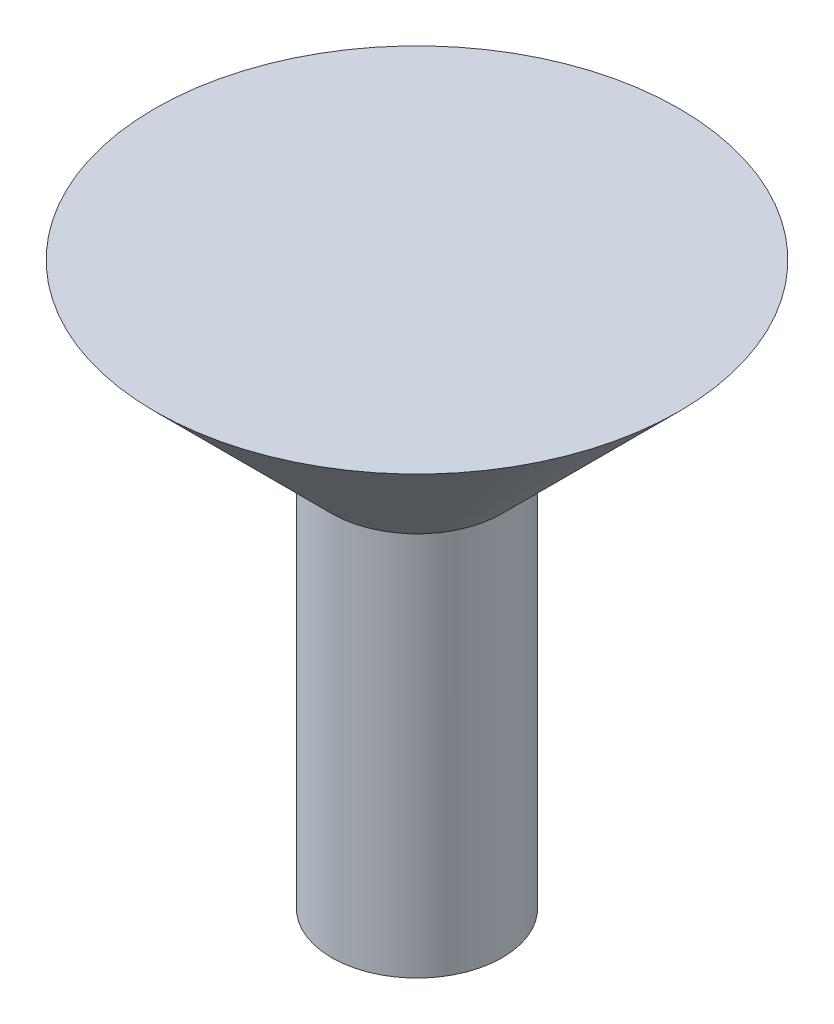
ISO-10303-21;
HEADER;
FILE_DESCRIPTION(('STEP AP214'),'2;1');
FILE_NAME('part.step','',(''),(''),'','','');
FILE_SCHEMA(('AUTOMOTIVE_DESIGN { 1 0 10303 214 1 1 1 1 }'));
ENDSEC;
DATA;
#1=APPLICATION_CONTEXT('core data for automotive mechanical design processes');
#2=APPLICATION_PROTOCOL_DEFINITION('international standard','automotive_design',2000,#1);
#3=PRODUCT_CONTEXT('',#1,'mechanical');
#4=PRODUCT('Part','Part','',(#3));
#5=PRODUCT_RELATED_PRODUCT_CATEGORY('part','',(#4));
#6=PRODUCT_DEFINITION_FORMATION('','',#4);
#7=PRODUCT_DEFINITION_CONTEXT('part definition',#1,'design');
#8=PRODUCT_DEFINITION('design','',#6,#7);
#9=PRODUCT_DEFINITION_SHAPE('','',#8);
#10=(LENGTH_UNIT() NAMED_UNIT(*) SI_UNIT(.MILLI.,.METRE.));
#11=(NAMED_UNIT(*) PLANE_ANGLE_UNIT() SI_UNIT($,.RADIAN.));
#12=(NAMED_UNIT(*) SI_UNIT($,.STERADIAN.) SOLID_ANGLE_UNIT());
#13=UNCERTAINTY_MEASURE_WITH_UNIT(LENGTH_MEASURE(1.E-05),#10,'distance_accuracy_value','');
#14=(GEOMETRIC_REPRESENTATION_CONTEXT(3) GLOBAL_UNCERTAINTY_ASSIGNED_CONTEXT((#13)) GLOBAL_UNIT_ASSIGNED_CONTEXT((#10,
#11,#12)) REPRESENTATION_CONTEXT('',''));
#15=CARTESIAN_POINT('',(0.,0.,0.));
#16=DIRECTION('',(0.,0.,1.));
#17=DIRECTION('',(1.,0.,0.));
#18=AXIS2_PLACEMENT_3D('',#15,#16,#17);
#19=CARTESIAN_POINT('',(-7.01715728752538,2.3,0.));
#20=DIRECTION('',(0.,1.,0.));
#21=DIRECTION('',(0.,0.,1.));
#22=AXIS2_PLACEMENT_3D('',#19,#20,#21);
#23=PLANE('',#22);
#24=CARTESIAN_POINT('',(-0.199999999999999,2.3,0.));
#25=DIRECTION('',(0.,1.,0.));
#26=DIRECTION('',(0.,0.,1.));
#27=AXIS2_PLACEMENT_3D('',#24,#25,#26);
#28=CIRCLE('',#27,6.81715728752538);
#29=CARTESIAN_POINT('',(-0.199999999999999,2.3,6.81715728752538));
#30=VERTEX_POINT('',#29);
#31=EDGE_CURVE('E10',#30,#30,#28,.T.);
#32=ORIENTED_EDGE('',*,*,#31,.T.);
#33=EDGE_LOOP('',(#32));
#34=FACE_BOUND('',#33,.T.);
#35=ADVANCED_FACE('F37',(#34),#23,.T.);
#36=CARTESIAN_POINT('',(-0.199999999999999,2.3,0.));
#37=DIRECTION('',(0.,1.,0.));
#38=DIRECTION('',(0.,0.,1.));
#39=AXIS2_PLACEMENT_3D('',#36,#37,#38);
#40=CONICAL_SURFACE('',#39,6.81715728752538,0.785398163397448);
#41=CARTESIAN_POINT('',(-0.199999999999999,-2.3,0.));
#42=DIRECTION('',(0.,-1.,0.));
#43=DIRECTION('',(0.,0.,-1.));
#44=AXIS2_PLACEMENT_3D('',#41,#42,#43);
#45=CIRCLE('',#44,2.21715728752538);
#46=CARTESIAN_POINT('',(-0.199999999999999,-2.3,2.21715728752538));
#47=VERTEX_POINT('',#46);
#48=EDGE_CURVE('E47',#47,#47,#45,.T.);
#49=CARTESIAN_POINT('',(-0.199999999999999,-2.3,2.21715728752538));
#50=CARTESIAN_POINT('',(-0.199999999999999,-2.25208333333333,2.26507395419205));
#51=CARTESIAN_POINT('',(-0.199999999999999,-2.20416666666667,2.31299062085871));
#52=CARTESIAN_POINT('',(-0.199999999999999,-2.10833333333333,2.40882395419205));
#53=CARTESIAN_POINT('',(-0.199999999999999,-2.06041666666667,2.45674062085871));
#54=CARTESIAN_POINT('',(-0.199999999999999,-1.96458333333333,2.55257395419205));
#55=CARTESIAN_POINT('',(-0.199999999999999,-1.91666666666667,2.60049062085871));
#56=CARTESIAN_POINT('',(-0.199999999999999,-1.82083333333333,2.69632395419205));
#57=CARTESIAN_POINT('',(-0.199999999999999,-1.77291666666667,2.74424062085871));
#58=CARTESIAN_POINT('',(-0.199999999999999,-1.67708333333333,2.84007395419205));
#59=CARTESIAN_POINT('',(-0.199999999999999,-1.62916666666667,2.88799062085871));
#60=CARTESIAN_POINT('',(-0.199999999999999,-1.53333333333333,2.98382395419205));
#61=CARTESIAN_POINT('',(-0.199999999999999,-1.48541666666667,3.03174062085871));
#62=CARTESIAN_POINT('',(-0.199999999999999,-1.38958333333333,3.12757395419205));
#63=CARTESIAN_POINT('',(-0.199999999999999,-1.34166666666667,3.17549062085871));
#64=CARTESIAN_POINT('',(-0.199999999999999,-1.24583333333333,3.27132395419205));
#65=CARTESIAN_POINT('',(-0.199999999999999,-1.19791666666667,3.31924062085871));
#66=CARTESIAN_POINT('',(-0.199999999999999,-1.10208333333333,3.41507395419205));
#67=CARTESIAN_POINT('',(-0.199999999999999,-1.05416666666667,3.46299062085871));
#68=CARTESIAN_POINT('',(-0.199999999999999,-0.958333333333333,3.55882395419205));
#69=CARTESIAN_POINT('',(-0.199999999999999,-0.910416666666667,3.60674062085871));
#70=CARTESIAN_POINT('',(-0.199999999999999,-0.814583333333333,3.70257395419205));
#71=CARTESIAN_POINT('',(-0.199999999999999,-0.766666666666666,3.75049062085871));
#72=CARTESIAN_POINT('',(-0.199999999999999,-0.670833333333333,3.84632395419205));
#73=CARTESIAN_POINT('',(-0.199999999999999,-0.622916666666667,3.89424062085871));
#74=CARTESIAN_POINT('',(-0.199999999999999,-0.527083333333333,3.99007395419205));
#75=CARTESIAN_POINT('',(-0.199999999999999,-0.479166666666667,4.03799062085871));
#76=CARTESIAN_POINT('',(-0.199999999999999,-0.383333333333333,4.13382395419205));
#77=CARTESIAN_POINT('',(-0.199999999999999,-0.335416666666667,4.18174062085872));
#78=CARTESIAN_POINT('',(-0.199999999999999,-0.239583333333333,4.27757395419205));
#79=CARTESIAN_POINT('',(-0.199999999999999,-0.191666666666667,4.32549062085871));
#80=CARTESIAN_POINT('',(-0.199999999999999,-0.0958333333333331,4.42132395419205));
#81=CARTESIAN_POINT('',(-0.199999999999999,-0.0479166666666666,4.46924062085871));
#82=CARTESIAN_POINT('',(-0.199999999999999,0.0479166666666666,4.56507395419205));
#83=CARTESIAN_POINT('',(-0.199999999999999,0.0958333333333331,4.61299062085871));
#84=CARTESIAN_POINT('',(-0.199999999999999,0.191666666666667,4.70882395419205));
#85=CARTESIAN_POINT('',(-0.199999999999999,0.239583333333333,4.75674062085871));
#86=CARTESIAN_POINT('',(-0.199999999999999,0.335416666666667,4.85257395419205));
#87=CARTESIAN_POINT('',(-0.199999999999999,0.383333333333333,4.90049062085871));
#88=CARTESIAN_POINT('',(-0.199999999999999,0.479166666666667,4.99632395419205));
#89=CARTESIAN_POINT('',(-0.199999999999999,0.527083333333333,5.04424062085871));
#90=CARTESIAN_POINT('',(-0.199999999999999,0.622916666666667,5.14007395419205));
#91=CARTESIAN_POINT('',(-0.199999999999999,0.670833333333333,5.18799062085871));
#92=CARTESIAN_POINT('',(-0.199999999999999,0.766666666666666,5.28382395419205));
#93=CARTESIAN_POINT('',(-0.199999999999999,0.814583333333333,5.33174062085871));
#94=CARTESIAN_POINT('',(-0.199999999999999,0.910416666666667,5.42757395419205));
#95=CARTESIAN_POINT('',(-0.199999999999999,0.958333333333333,5.47549062085871));
#96=CARTESIAN_POINT('',(-0.199999999999999,1.05416666666667,5.57132395419205));
#97=CARTESIAN_POINT('',(-0.199999999999999,1.10208333333333,5.61924062085871));
#98=CARTESIAN_POINT('',(-0.199999999999999,1.19791666666667,5.71507395419205));
#99=CARTESIAN_POINT('',(-0.199999999999999,1.24583333333333,5.76299062085871));
#100=CARTESIAN_POINT('',(-0.199999999999999,1.34166666666667,5.85882395419205));
#101=CARTESIAN_POINT('',(-0.199999999999999,1.38958333333333,5.90674062085871));
#102=CARTESIAN_POINT('',(-0.199999999999999,1.48541666666667,6.00257395419205));
#103=CARTESIAN_POINT('',(-0.199999999999999,1.53333333333333,6.05049062085871));
#104=CARTESIAN_POINT('',(-0.199999999999999,1.62916666666667,6.14632395419205));
#105=CARTESIAN_POINT('',(-0.199999999999999,1.67708333333333,6.19424062085871));
#106=CARTESIAN_POINT('',(-0.199999999999999,1.77291666666667,6.29007395419205));
#107=CARTESIAN_POINT('',(-0.199999999999999,1.82083333333333,6.33799062085871));
#108=CARTESIAN_POINT('',(-0.199999999999999,1.91666666666667,6.43382395419205));
#109=CARTESIAN_POINT('',(-0.199999999999999,1.96458333333333,6.48174062085871));
#110=CARTESIAN_POINT('',(-0.199999999999999,2.06041666666667,6.57757395419205));
#111=CARTESIAN_POINT('',(-0.199999999999999,2.10833333333333,6.62549062085871));
#112=CARTESIAN_POINT('',(-0.199999999999999,2.20416666666667,6.72132395419205));
#113=CARTESIAN_POINT('',(-0.199999999999999,2.25208333333333,6.76924062085871));
#114=CARTESIAN_POINT('',(-0.199999999999999,2.3,6.81715728752538));
#115=B_SPLINE_CURVE_WITH_KNOTS('',3,(#49,#50,#51,#52,#53,#54,#55,#56,#57,#58,#59,#60,#61,#62,
#63,#64,#65,#66,#67,#68,#69,#70,#71,#72,#73,#74,#75,#76,#77,#78,#79,#80,#81,#82,#83,#84,#85,#86,
#87,#88,#89,#90,#91,#92,#93,#94,#95,#96,#97,#98,#99,#100,#101,#102,#103,#104,#105,#106,#107,
#108,#109,#110,#111,#112,#113,#114),.UNSPECIFIED.,.F.,.F.,(4,2,2,2,2,2,2,2,2,2,2,2,2,2,2,2,2,2,
2,2,2,2,2,2,2,2,2,2,2,2,2,2,4),(0.,0.203293199591132,0.406586399182264,0.609879598773397,
0.81317279836453,1.01646599795566,1.21975919754679,1.42305239713793,1.62634559672906,
1.82963879632019,2.03293199591132,2.23622519550246,2.43951839509359,2.64281159468472,
2.84610479427585,3.04939799386699,3.25269119345812,3.45598439304925,3.65927759264038,
3.86257079223152,4.06586399182265,4.26915719141378,4.47245039100491,4.67574359059604,
4.87903679018718,5.08232998977831,5.28562318936944,5.48891638896057,5.69220958855171,
5.89550278814284,6.09879598773397,6.3020891873251,6.50538238691624),.UNSPECIFIED.);
#116=EDGE_CURVE('BSEAM75',#47,#30,#115,.T.);
#117=ORIENTED_EDGE('',*,*,#48,.F.);
#118=ORIENTED_EDGE('',*,*,#31,.F.);
#119=ORIENTED_EDGE('',*,*,#116,.T.);
#120=ORIENTED_EDGE('',*,*,#116,.F.);
#121=EDGE_LOOP('',(#117,#119,#118,#120));
#122=FACE_BOUND('',#121,.T.);
#123=ADVANCED_FACE('F75',(#122),#40,.T.);
#124=CARTESIAN_POINT('',(-0.199999999999999,-12.3,0.));
#125=DIRECTION('',(0.,1.,0.));
#126=DIRECTION('',(0.,0.,1.));
#127=AXIS2_PLACEMENT_3D('',#124,#125,#126);
#128=CYLINDRICAL_SURFACE('',#127,2.21715728752538);
#129=CARTESIAN_POINT('',(-0.199999999999999,-12.3,0.));
#130=DIRECTION('',(0.,-1.,0.));
#131=DIRECTION('',(0.,0.,-1.));
#132=AXIS2_PLACEMENT_3D('',#129,#130,#131);
#133=CIRCLE('',#132,2.21715728752538);
#134=CARTESIAN_POINT('',(-0.199999999999999,-12.3,-2.21715728752538));
#135=VERTEX_POINT('',#134);
#136=EDGE_CURVE('E43',#135,#135,#133,.T.);
#137=ORIENTED_EDGE('',*,*,#136,.F.);
#138=EDGE_LOOP('',(#137));
#139=FACE_BOUND('',#138,.T.);
#140=ORIENTED_EDGE('',*,*,#48,.T.);
#141=EDGE_LOOP('',(#140));
#142=FACE_BOUND('',#141,.T.);
#143=ADVANCED_FACE('F70',(#139,#142),#128,.T.);
#144=CARTESIAN_POINT('',(-0.199999999999999,-12.3,0.));
#145=DIRECTION('',(0.,-1.,0.));
#146=DIRECTION('',(0.,0.,-1.));
#147=AXIS2_PLACEMENT_3D('',#144,#145,#146);
#148=PLANE('',#147);
#149=CARTESIAN_POINT('',(-0.199999999999999,-12.3,0.));
#150=DIRECTION('',(0.,-1.,0.));
#151=DIRECTION('',(0.,0.,-1.));
#152=AXIS2_PLACEMENT_3D('',#149,#150,#151);
#153=CIRCLE('',#152,1.55);
#154=CARTESIAN_POINT('',(-0.199999999999999,-12.3,-1.55));
#155=VERTEX_POINT('',#154);
#156=EDGE_CURVE('E54',#155,#155,#153,.T.);
#157=ORIENTED_EDGE('',*,*,#156,.F.);
#158=EDGE_LOOP('',(#157));
#159=FACE_BOUND('',#158,.T.);
#160=ORIENTED_EDGE('',*,*,#136,.T.);
#161=EDGE_LOOP('',(#160));
#162=FACE_BOUND('',#161,.T.);
#163=ADVANCED_FACE('F65',(#159,#162),#148,.T.);
#164=CARTESIAN_POINT('',(-0.199999999999999,-7.3,0.));
#165=DIRECTION('',(0.,-1.,0.));
#166=DIRECTION('',(0.,0.,-1.));
#167=AXIS2_PLACEMENT_3D('',#164,#165,#166);
#168=CYLINDRICAL_SURFACE('',#167,1.55);
#169=CARTESIAN_POINT('',(-0.199999999999999,-7.3,0.));
#170=DIRECTION('',(0.,-1.,0.));
#171=DIRECTION('',(0.,0.,-1.));
#172=AXIS2_PLACEMENT_3D('',#169,#170,#171);
#173=CIRCLE('',#172,1.55);
#174=CARTESIAN_POINT('',(-0.199999999999999,-7.3,-1.55));
#175=VERTEX_POINT('',#174);
#176=EDGE_CURVE('E52',#175,#175,#173,.T.);
#177=ORIENTED_EDGE('',*,*,#176,.F.);
#178=EDGE_LOOP('',(#177));
#179=FACE_BOUND('',#178,.T.);
#180=ORIENTED_EDGE('',*,*,#156,.T.);
#181=EDGE_LOOP('',(#180));
#182=FACE_BOUND('',#181,.T.);
#183=ADVANCED_FACE('F62',(#179,#182),#168,.F.);
#184=CARTESIAN_POINT('',(-0.199999999999999,-7.3,0.));
#185=DIRECTION('',(0.,-1.,0.));
#186=DIRECTION('',(0.,0.,-1.));
#187=AXIS2_PLACEMENT_3D('',#184,#185,#186);
#188=PLANE('',#187);
#189=ORIENTED_EDGE('',*,*,#176,.T.);
#190=EDGE_LOOP('',(#189));
#191=FACE_BOUND('',#190,.T.);
#192=ADVANCED_FACE('F60',(#191),#188,.T.);
#193=CLOSED_SHELL('',(#35,#123,#143,#163,#183,#192));
#194=MANIFOLD_SOLID_BREP('B2',#193);
#195=ADVANCED_BREP_SHAPE_REPRESENTATION('',(#18,#194),#14);
#196=SHAPE_DEFINITION_REPRESENTATION(#9,#195);
ENDSEC;
END-ISO-10303-21;
